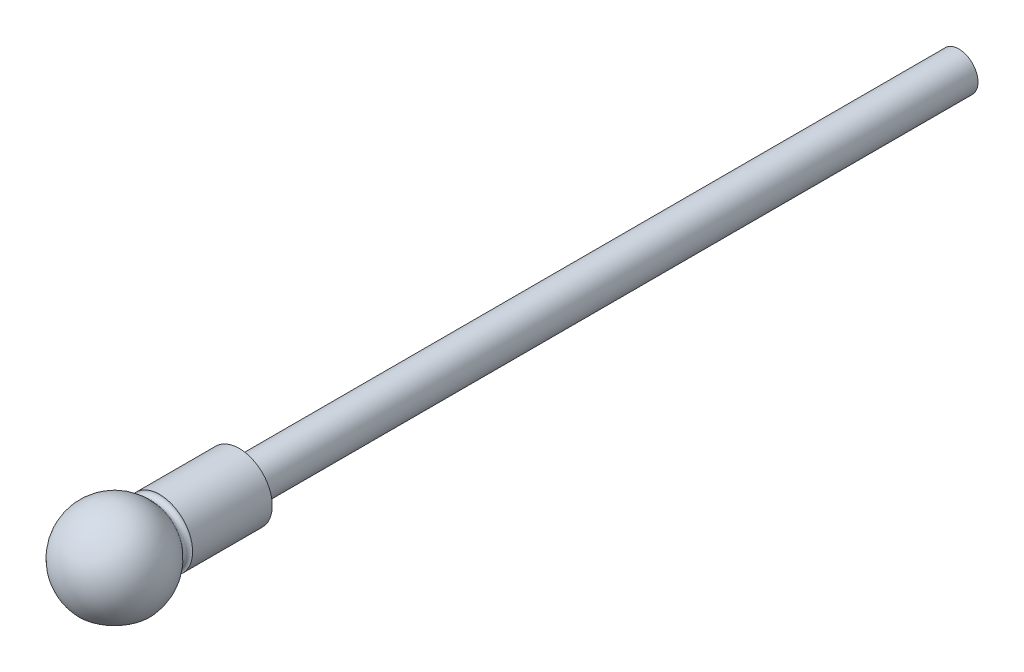
ISO-10303-21;
HEADER;
FILE_DESCRIPTION(('STEP AP214'),'2;1');
FILE_NAME('part.step','',(''),(''),'','','');
FILE_SCHEMA(('AUTOMOTIVE_DESIGN { 1 0 10303 214 1 1 1 1 }'));
ENDSEC;
DATA;
#1=APPLICATION_CONTEXT('core data for automotive mechanical design processes');
#2=APPLICATION_PROTOCOL_DEFINITION('international standard','automotive_design',2000,#1);
#3=PRODUCT_CONTEXT('',#1,'mechanical');
#4=PRODUCT('Part','Part','',(#3));
#5=PRODUCT_RELATED_PRODUCT_CATEGORY('part','',(#4));
#6=PRODUCT_DEFINITION_FORMATION('','',#4);
#7=PRODUCT_DEFINITION_CONTEXT('part definition',#1,'design');
#8=PRODUCT_DEFINITION('design','',#6,#7);
#9=PRODUCT_DEFINITION_SHAPE('','',#8);
#10=(LENGTH_UNIT() NAMED_UNIT(*) SI_UNIT(.MILLI.,.METRE.));
#11=(NAMED_UNIT(*) PLANE_ANGLE_UNIT() SI_UNIT($,.RADIAN.));
#12=(NAMED_UNIT(*) SI_UNIT($,.STERADIAN.) SOLID_ANGLE_UNIT());
#13=UNCERTAINTY_MEASURE_WITH_UNIT(LENGTH_MEASURE(1.E-05),#10,'distance_accuracy_value','');
#14=(GEOMETRIC_REPRESENTATION_CONTEXT(3) GLOBAL_UNCERTAINTY_ASSIGNED_CONTEXT((#13)) GLOBAL_UNIT_ASSIGNED_CONTEXT((#10,
#11,#12)) REPRESENTATION_CONTEXT('',''));
#15=CARTESIAN_POINT('',(0.,0.,0.));
#16=DIRECTION('',(0.,0.,1.));
#17=DIRECTION('',(1.,0.,0.));
#18=AXIS2_PLACEMENT_3D('',#15,#16,#17);
#19=CARTESIAN_POINT('',(0.,0.,122.555));
#20=DIRECTION('',(0.,0.,1.));
#21=DIRECTION('',(0.,1.,0.));
#22=AXIS2_PLACEMENT_3D('',#19,#20,#21);
#23=SPHERICAL_SURFACE('',#22,5.);
#24=CARTESIAN_POINT('',(0.,0.,122.555));
#25=DIRECTION('',(0.,1.,0.));
#26=DIRECTION('',(0.,0.,1.));
#27=AXIS2_PLACEMENT_3D('',#24,#25,#26);
#28=SPHERICAL_SURFACE('',#27,5.);
#29=CARTESIAN_POINT('',(0.,0.,122.555));
#30=DIRECTION('',(0.,1.,0.));
#31=DIRECTION('',(0.,0.,1.));
#32=AXIS2_PLACEMENT_3D('',#29,#30,#31);
#33=CIRCLE('',#32,5.00000000000003);
#34=CARTESIAN_POINT('',(0.,0.,127.555));
#35=VERTEX_POINT('',#34);
#36=EDGE_CURVE('E60',#35,#35,#33,.T.);
#37=ORIENTED_EDGE('',*,*,#36,.F.);
#38=EDGE_LOOP('',(#37));
#39=FACE_BOUND('',#38,.T.);
#40=ADVANCED_FACE('F34',(#39),#28,.F.);
#41=CARTESIAN_POINT('',(0.,-5.05,127.555));
#42=DIRECTION('',(0.,1.,0.));
#43=DIRECTION('',(0.,0.,-1.));
#44=AXIS2_PLACEMENT_3D('',#41,#42,#43);
#45=PLANE('',#44);
#46=CARTESIAN_POINT('',(0.,-5.05,122.555));
#47=DIRECTION('',(0.,1.,0.));
#48=DIRECTION('',(0.,0.,1.));
#49=AXIS2_PLACEMENT_3D('',#46,#47,#48);
#50=CIRCLE('',#49,5.00000000000003);
#51=CARTESIAN_POINT('',(0.,-5.05,127.555));
#52=VERTEX_POINT('',#51);
#53=EDGE_CURVE('E57',#52,#52,#50,.T.);
#54=ORIENTED_EDGE('',*,*,#53,.T.);
#55=EDGE_LOOP('',(#54));
#56=FACE_BOUND('',#55,.T.);
#57=CARTESIAN_POINT('',(0.,-5.05,122.555));
#58=DIRECTION('',(0.,1.,0.));
#59=DIRECTION('',(0.,0.,1.));
#60=AXIS2_PLACEMENT_3D('',#57,#58,#59);
#61=CIRCLE('',#60,5.40902024399986);
#62=CARTESIAN_POINT('',(0.,-5.05,127.964020244));
#63=VERTEX_POINT('',#62);
#64=EDGE_CURVE('E54',#63,#63,#61,.T.);
#65=ORIENTED_EDGE('',*,*,#64,.F.);
#66=EDGE_LOOP('',(#65));
#67=FACE_BOUND('',#66,.T.);
#68=ADVANCED_FACE('F78',(#56,#67),#45,.F.);
#69=CARTESIAN_POINT('',(0.,0.,122.555));
#70=DIRECTION('',(0.,-1.,0.));
#71=DIRECTION('',(0.,0.,1.));
#72=AXIS2_PLACEMENT_3D('',#69,#70,#71);
#73=CYLINDRICAL_SURFACE('',#72,5.00000000000003);
#74=ORIENTED_EDGE('',*,*,#36,.T.);
#75=EDGE_LOOP('',(#74));
#76=FACE_BOUND('',#75,.T.);
#77=ORIENTED_EDGE('',*,*,#53,.F.);
#78=EDGE_LOOP('',(#77));
#79=FACE_BOUND('',#78,.T.);
#80=ADVANCED_FACE('F84',(#76,#79),#73,.F.);
#81=CARTESIAN_POINT('',(0.,0.,103.505));
#82=DIRECTION('',(0.,0.,-1.));
#83=DIRECTION('',(0.,-1.,0.));
#84=AXIS2_PLACEMENT_3D('',#81,#82,#83);
#85=PLANE('',#84);
#86=CARTESIAN_POINT('',(0.,0.,103.505));
#87=DIRECTION('',(0.,0.,-1.));
#88=DIRECTION('',(0.,1.,0.));
#89=AXIS2_PLACEMENT_3D('',#86,#87,#88);
#90=CIRCLE('',#89,2.92099999999998);
#91=CARTESIAN_POINT('',(0.,2.92099999999998,103.505));
#92=VERTEX_POINT('',#91);
#93=EDGE_CURVE('E10',#92,#92,#90,.T.);
#94=ORIENTED_EDGE('',*,*,#93,.F.);
#95=EDGE_LOOP('',(#94));
#96=FACE_BOUND('',#95,.T.);
#97=CARTESIAN_POINT('',(0.,0.,103.505));
#98=DIRECTION('',(0.,0.,-1.));
#99=DIRECTION('',(0.,1.,0.));
#100=AXIS2_PLACEMENT_3D('',#97,#98,#99);
#101=CIRCLE('',#100,5.05);
#102=CARTESIAN_POINT('',(0.,5.05,103.505));
#103=VERTEX_POINT('',#102);
#104=EDGE_CURVE('E41',#103,#103,#101,.T.);
#105=ORIENTED_EDGE('',*,*,#104,.T.);
#106=EDGE_LOOP('',(#105));
#107=FACE_BOUND('',#106,.T.);
#108=ADVANCED_FACE('F36',(#96,#107),#85,.T.);
#109=CARTESIAN_POINT('',(0.,0.,103.505));
#110=DIRECTION('',(0.,0.,1.));
#111=DIRECTION('',(0.,1.,0.));
#112=AXIS2_PLACEMENT_3D('',#109,#110,#111);
#113=CYLINDRICAL_SURFACE('',#112,5.05);
#114=ORIENTED_EDGE('',*,*,#104,.F.);
#115=EDGE_LOOP('',(#114));
#116=FACE_BOUND('',#115,.T.);
#117=CARTESIAN_POINT('',(0.,0.,115.670302007297));
#118=DIRECTION('',(0.,0.,-1.));
#119=DIRECTION('',(0.,1.,0.));
#120=AXIS2_PLACEMENT_3D('',#117,#118,#119);
#121=CIRCLE('',#120,5.05);
#122=CARTESIAN_POINT('',(0.,5.05,115.670302007297));
#123=VERTEX_POINT('',#122);
#124=EDGE_CURVE('E45',#123,#123,#121,.T.);
#125=ORIENTED_EDGE('',*,*,#124,.T.);
#126=EDGE_LOOP('',(#125));
#127=FACE_BOUND('',#126,.T.);
#128=ADVANCED_FACE('F95',(#116,#127),#113,.T.);
#129=CARTESIAN_POINT('',(0.,0.,116.305302007297));
#130=DIRECTION('',(0.,0.,1.));
#131=DIRECTION('',(0.,1.,0.));
#132=AXIS2_PLACEMENT_3D('',#129,#130,#131);
#133=TOROIDAL_SURFACE('',#132,5.05,0.635000000000001);
#134=ORIENTED_EDGE('',*,*,#124,.F.);
#135=EDGE_LOOP('',(#134));
#136=FACE_BOUND('',#135,.T.);
#137=CARTESIAN_POINT('',(0.,0.,116.799210933914));
#138=DIRECTION('',(0.,0.,-1.));
#139=DIRECTION('',(0.,1.,0.));
#140=AXIS2_PLACEMENT_3D('',#137,#138,#139);
#141=CIRCLE('',#140,4.65090230242688);
#142=CARTESIAN_POINT('',(0.,4.65090230242689,116.799210933914));
#143=VERTEX_POINT('',#142);
#144=EDGE_CURVE('E49',#143,#143,#141,.T.);
#145=ORIENTED_EDGE('',*,*,#144,.T.);
#146=EDGE_LOOP('',(#145));
#147=FACE_BOUND('',#146,.T.);
#148=ADVANCED_FACE('F92',(#136,#147),#133,.F.);
#149=CARTESIAN_POINT('',(0.,0.,122.555));
#150=DIRECTION('',(0.,0.,1.));
#151=DIRECTION('',(0.,1.,0.));
#152=AXIS2_PLACEMENT_3D('',#149,#150,#151);
#153=SPHERICAL_SURFACE('',#152,7.40000000000003);
#154=ORIENTED_EDGE('',*,*,#64,.T.);
#155=EDGE_LOOP('',(#154));
#156=FACE_BOUND('',#155,.T.);
#157=ORIENTED_EDGE('',*,*,#144,.F.);
#158=EDGE_LOOP('',(#157));
#159=FACE_BOUND('',#158,.T.);
#160=ADVANCED_FACE('F75',(#156,#159),#153,.T.);
#161=CARTESIAN_POINT('',(0.,2.921,-6.411));
#162=DIRECTION('',(0.,0.,-1.));
#163=DIRECTION('',(0.,1.,0.));
#164=AXIS2_PLACEMENT_3D('',#161,#162,#163);
#165=PLANE('',#164);
#166=CARTESIAN_POINT('',(0.,0.,-6.411));
#167=DIRECTION('',(0.,0.,-1.));
#168=DIRECTION('',(0.,1.,0.));
#169=AXIS2_PLACEMENT_3D('',#166,#167,#168);
#170=CIRCLE('',#169,2.92099999999996);
#171=CARTESIAN_POINT('',(0.,2.921,-6.411));
#172=VERTEX_POINT('',#171);
#173=EDGE_CURVE('E63',#172,#172,#170,.T.);
#174=ORIENTED_EDGE('',*,*,#173,.T.);
#175=EDGE_LOOP('',(#174));
#176=FACE_BOUND('',#175,.T.);
#177=ADVANCED_FACE('F67',(#176),#165,.T.);
#178=CARTESIAN_POINT('',(0.,0.,103.505));
#179=DIRECTION('',(0.,0.,-1.));
#180=DIRECTION('',(0.,1.,0.));
#181=AXIS2_PLACEMENT_3D('',#178,#179,#180);
#182=CYLINDRICAL_SURFACE('',#181,2.92099999999998);
#183=ORIENTED_EDGE('',*,*,#93,.T.);
#184=EDGE_LOOP('',(#183));
#185=FACE_BOUND('',#184,.T.);
#186=ORIENTED_EDGE('',*,*,#173,.F.);
#187=EDGE_LOOP('',(#186));
#188=FACE_BOUND('',#187,.T.);
#189=ADVANCED_FACE('F69',(#185,#188),#182,.T.);
#190=CLOSED_SHELL('',(#40,#68,#80,#108,#128,#148,#160,#177,#189));
#191=MANIFOLD_SOLID_BREP('B2',#190);
#192=ADVANCED_BREP_SHAPE_REPRESENTATION('',(#18,#191),#14);
#193=SHAPE_DEFINITION_REPRESENTATION(#9,#192);
ENDSEC;
END-ISO-10303-21;
